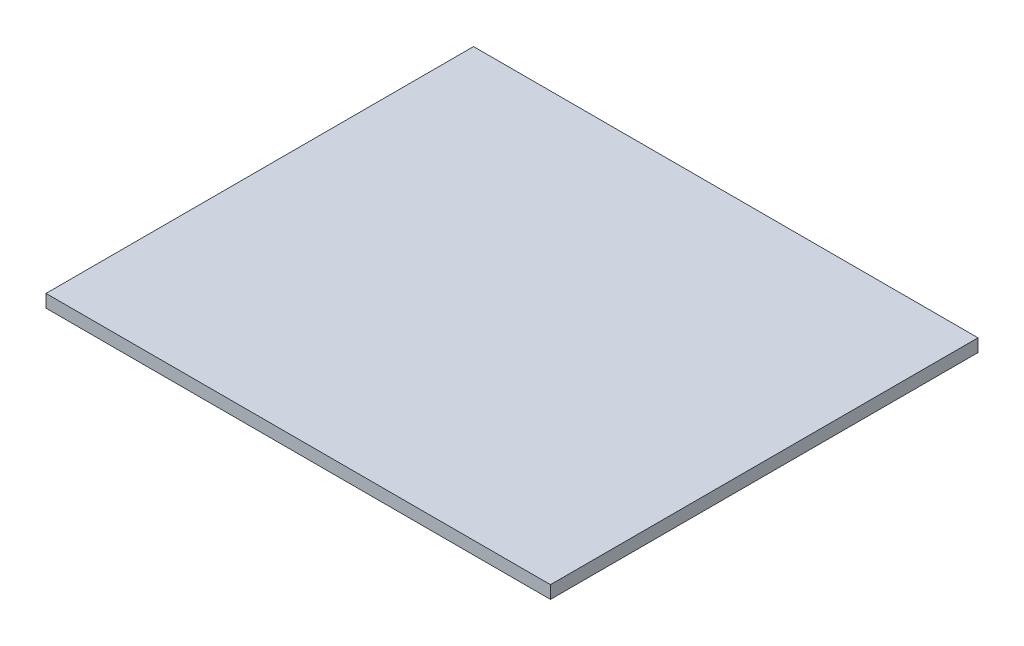
ISO-10303-21;
HEADER;
FILE_DESCRIPTION(('STEP AP214'),'2;1');
FILE_NAME('part.step','',(''),(''),'','','');
FILE_SCHEMA(('AUTOMOTIVE_DESIGN { 1 0 10303 214 1 1 1 1 }'));
ENDSEC;
DATA;
#1=APPLICATION_CONTEXT('core data for automotive mechanical design processes');
#2=APPLICATION_PROTOCOL_DEFINITION('international standard','automotive_design',2000,#1);
#3=PRODUCT_CONTEXT('',#1,'mechanical');
#4=PRODUCT('Part','Part','',(#3));
#5=PRODUCT_RELATED_PRODUCT_CATEGORY('part','',(#4));
#6=PRODUCT_DEFINITION_FORMATION('','',#4);
#7=PRODUCT_DEFINITION_CONTEXT('part definition',#1,'design');
#8=PRODUCT_DEFINITION('design','',#6,#7);
#9=PRODUCT_DEFINITION_SHAPE('','',#8);
#10=(LENGTH_UNIT() NAMED_UNIT(*) SI_UNIT(.MILLI.,.METRE.));
#11=(NAMED_UNIT(*) PLANE_ANGLE_UNIT() SI_UNIT($,.RADIAN.));
#12=(NAMED_UNIT(*) SI_UNIT($,.STERADIAN.) SOLID_ANGLE_UNIT());
#13=UNCERTAINTY_MEASURE_WITH_UNIT(LENGTH_MEASURE(1.E-05),#10,'distance_accuracy_value','');
#14=(GEOMETRIC_REPRESENTATION_CONTEXT(3) GLOBAL_UNCERTAINTY_ASSIGNED_CONTEXT((#13)) GLOBAL_UNIT_ASSIGNED_CONTEXT((#10,
#11,#12)) REPRESENTATION_CONTEXT('',''));
#15=CARTESIAN_POINT('',(0.,0.,0.));
#16=DIRECTION('',(0.,0.,1.));
#17=DIRECTION('',(1.,0.,0.));
#18=AXIS2_PLACEMENT_3D('',#15,#16,#17);
#19=CARTESIAN_POINT('',(39.35,2.,-33.35));
#20=DIRECTION('',(-1.,0.,0.));
#21=DIRECTION('',(0.,0.,1.));
#22=AXIS2_PLACEMENT_3D('',#19,#20,#21);
#23=PLANE('',#22);
#24=DIRECTION('',(0.,0.,-1.));
#25=VECTOR('',#24,1.);
#26=CARTESIAN_POINT('',(39.35,0.,-33.35));
#27=LINE('',#26,#25);
#28=CARTESIAN_POINT('',(39.35,0.,33.35));
#29=VERTEX_POINT('',#28);
#30=CARTESIAN_POINT('',(39.35,0.,-33.35));
#31=VERTEX_POINT('',#30);
#32=EDGE_CURVE('E100',#29,#31,#27,.T.);
#33=ORIENTED_EDGE('',*,*,#32,.T.);
#34=DIRECTION('',(0.,-1.,0.));
#35=VECTOR('',#34,1.);
#36=CARTESIAN_POINT('',(39.35,2.,-33.35));
#37=LINE('',#36,#35);
#38=CARTESIAN_POINT('',(39.35,2.,-33.35));
#39=VERTEX_POINT('',#38);
#40=EDGE_CURVE('E11',#39,#31,#37,.T.);
#41=ORIENTED_EDGE('',*,*,#40,.F.);
#42=DIRECTION('',(0.,0.,-1.));
#43=VECTOR('',#42,1.);
#44=CARTESIAN_POINT('',(39.35,2.,-33.35));
#45=LINE('',#44,#43);
#46=CARTESIAN_POINT('',(39.35,2.,33.35));
#47=VERTEX_POINT('',#46);
#48=EDGE_CURVE('E88',#47,#39,#45,.T.);
#49=ORIENTED_EDGE('',*,*,#48,.F.);
#50=DIRECTION('',(0.,-1.,0.));
#51=VECTOR('',#50,1.);
#52=CARTESIAN_POINT('',(39.35,2.,33.35));
#53=LINE('',#52,#51);
#54=EDGE_CURVE('E96',#47,#29,#53,.T.);
#55=ORIENTED_EDGE('',*,*,#54,.T.);
#56=EDGE_LOOP('',(#33,#41,#49,#55));
#57=FACE_BOUND('',#56,.T.);
#58=ADVANCED_FACE('F37',(#57),#23,.F.);
#59=CARTESIAN_POINT('',(-39.35,2.,-33.35));
#60=DIRECTION('',(0.,0.,1.));
#61=DIRECTION('',(1.,0.,0.));
#62=AXIS2_PLACEMENT_3D('',#59,#60,#61);
#63=PLANE('',#62);
#64=DIRECTION('',(-1.,0.,0.));
#65=VECTOR('',#64,1.);
#66=CARTESIAN_POINT('',(-39.35,0.,-33.35));
#67=LINE('',#66,#65);
#68=CARTESIAN_POINT('',(-39.35,0.,-33.35));
#69=VERTEX_POINT('',#68);
#70=EDGE_CURVE('E92',#31,#69,#67,.T.);
#71=ORIENTED_EDGE('',*,*,#70,.T.);
#72=DIRECTION('',(0.,-1.,0.));
#73=VECTOR('',#72,1.);
#74=CARTESIAN_POINT('',(-39.35,2.,-33.35));
#75=LINE('',#74,#73);
#76=CARTESIAN_POINT('',(-39.35,2.,-33.35));
#77=VERTEX_POINT('',#76);
#78=EDGE_CURVE('E45',#77,#69,#75,.T.);
#79=ORIENTED_EDGE('',*,*,#78,.F.);
#80=DIRECTION('',(-1.,0.,0.));
#81=VECTOR('',#80,1.);
#82=CARTESIAN_POINT('',(-39.35,2.,-33.35));
#83=LINE('',#82,#81);
#84=EDGE_CURVE('E83',#39,#77,#83,.T.);
#85=ORIENTED_EDGE('',*,*,#84,.F.);
#86=ORIENTED_EDGE('',*,*,#40,.T.);
#87=EDGE_LOOP('',(#71,#79,#85,#86));
#88=FACE_BOUND('',#87,.T.);
#89=ADVANCED_FACE('F91',(#88),#63,.F.);
#90=CARTESIAN_POINT('',(-39.35,2.,-33.35));
#91=DIRECTION('',(1.,0.,0.));
#92=DIRECTION('',(0.,0.,-1.));
#93=AXIS2_PLACEMENT_3D('',#90,#91,#92);
#94=PLANE('',#93);
#95=DIRECTION('',(0.,0.,1.));
#96=VECTOR('',#95,1.);
#97=CARTESIAN_POINT('',(-39.35,0.,-33.35));
#98=LINE('',#97,#96);
#99=CARTESIAN_POINT('',(-39.35,0.,33.35));
#100=VERTEX_POINT('',#99);
#101=EDGE_CURVE('E70',#69,#100,#98,.T.);
#102=ORIENTED_EDGE('',*,*,#101,.T.);
#103=DIRECTION('',(0.,-1.,0.));
#104=VECTOR('',#103,1.);
#105=CARTESIAN_POINT('',(-39.35,2.,33.35));
#106=LINE('',#105,#104);
#107=CARTESIAN_POINT('',(-39.35,2.,33.35));
#108=VERTEX_POINT('',#107);
#109=EDGE_CURVE('E93',#108,#100,#106,.T.);
#110=ORIENTED_EDGE('',*,*,#109,.F.);
#111=DIRECTION('',(0.,0.,1.));
#112=VECTOR('',#111,1.);
#113=CARTESIAN_POINT('',(-39.35,2.,-33.35));
#114=LINE('',#113,#112);
#115=EDGE_CURVE('E86',#77,#108,#114,.T.);
#116=ORIENTED_EDGE('',*,*,#115,.F.);
#117=ORIENTED_EDGE('',*,*,#78,.T.);
#118=EDGE_LOOP('',(#102,#110,#116,#117));
#119=FACE_BOUND('',#118,.T.);
#120=ADVANCED_FACE('F94',(#119),#94,.F.);
#121=CARTESIAN_POINT('',(-39.35,2.,33.35));
#122=DIRECTION('',(0.,0.,-1.));
#123=DIRECTION('',(-1.,0.,0.));
#124=AXIS2_PLACEMENT_3D('',#121,#122,#123);
#125=PLANE('',#124);
#126=DIRECTION('',(1.,0.,0.));
#127=VECTOR('',#126,1.);
#128=CARTESIAN_POINT('',(-39.35,0.,33.35));
#129=LINE('',#128,#127);
#130=EDGE_CURVE('E76',#100,#29,#129,.T.);
#131=ORIENTED_EDGE('',*,*,#130,.T.);
#132=ORIENTED_EDGE('',*,*,#54,.F.);
#133=DIRECTION('',(1.,0.,0.));
#134=VECTOR('',#133,1.);
#135=CARTESIAN_POINT('',(-39.35,2.,33.35));
#136=LINE('',#135,#134);
#137=EDGE_CURVE('E53',#108,#47,#136,.T.);
#138=ORIENTED_EDGE('',*,*,#137,.F.);
#139=ORIENTED_EDGE('',*,*,#109,.T.);
#140=EDGE_LOOP('',(#131,#132,#138,#139));
#141=FACE_BOUND('',#140,.T.);
#142=ADVANCED_FACE('F107',(#141),#125,.F.);
#143=CARTESIAN_POINT('',(0.,2.,0.));
#144=DIRECTION('',(0.,1.,0.));
#145=DIRECTION('',(0.,0.,1.));
#146=AXIS2_PLACEMENT_3D('',#143,#144,#145);
#147=PLANE('',#146);
#148=ORIENTED_EDGE('',*,*,#48,.T.);
#149=ORIENTED_EDGE('',*,*,#84,.T.);
#150=ORIENTED_EDGE('',*,*,#115,.T.);
#151=ORIENTED_EDGE('',*,*,#137,.T.);
#152=EDGE_LOOP('',(#148,#149,#150,#151));
#153=FACE_BOUND('',#152,.T.);
#154=ADVANCED_FACE('F84',(#153),#147,.T.);
#155=CARTESIAN_POINT('',(0.,0.,0.));
#156=DIRECTION('',(0.,1.,0.));
#157=DIRECTION('',(0.,0.,1.));
#158=AXIS2_PLACEMENT_3D('',#155,#156,#157);
#159=PLANE('',#158);
#160=ORIENTED_EDGE('',*,*,#32,.F.);
#161=ORIENTED_EDGE('',*,*,#130,.F.);
#162=ORIENTED_EDGE('',*,*,#101,.F.);
#163=ORIENTED_EDGE('',*,*,#70,.F.);
#164=EDGE_LOOP('',(#160,#161,#162,#163));
#165=FACE_BOUND('',#164,.T.);
#166=ADVANCED_FACE('F110',(#165),#159,.F.);
#167=CLOSED_SHELL('',(#58,#89,#120,#142,#154,#166));
#168=MANIFOLD_SOLID_BREP('B2',#167);
#169=ADVANCED_BREP_SHAPE_REPRESENTATION('',(#18,#168),#14);
#170=SHAPE_DEFINITION_REPRESENTATION(#9,#169);
ENDSEC;
END-ISO-10303-21;
